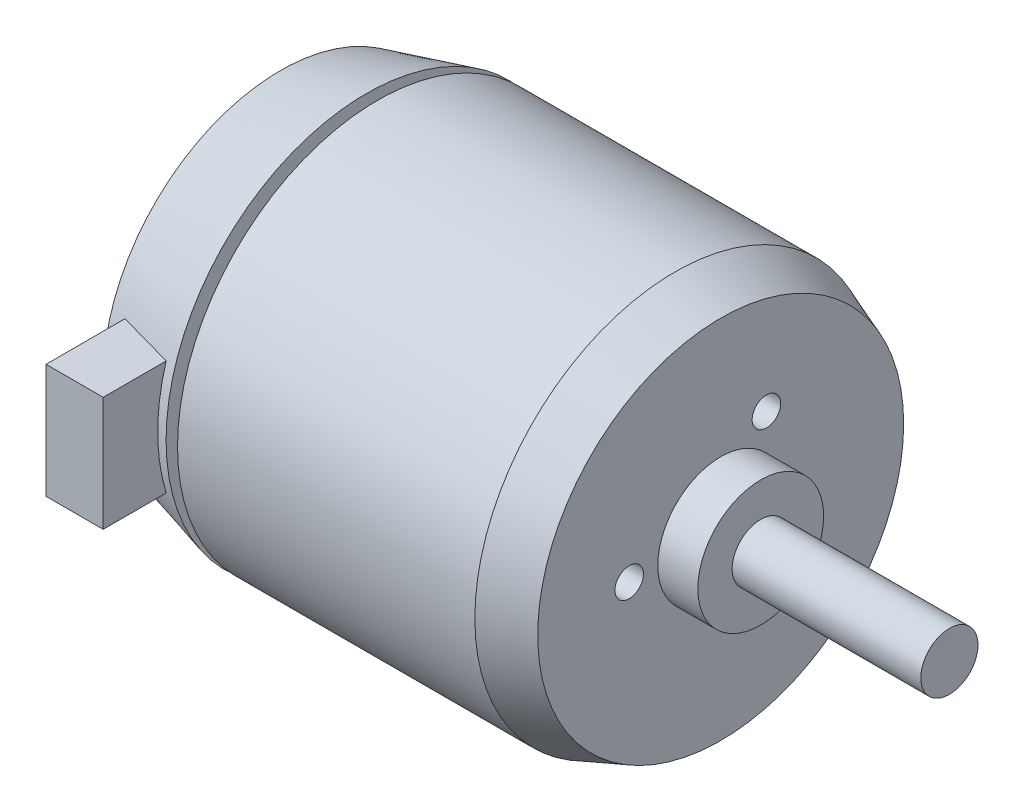
ISO-10303-21;
HEADER;
FILE_DESCRIPTION(('STEP AP214'),'2;1');
FILE_NAME('part.step','',(''),(''),'','','');
FILE_SCHEMA(('AUTOMOTIVE_DESIGN { 1 0 10303 214 1 1 1 1 }'));
ENDSEC;
DATA;
#1=APPLICATION_CONTEXT('core data for automotive mechanical design processes');
#2=APPLICATION_PROTOCOL_DEFINITION('international standard','automotive_design',2000,#1);
#3=PRODUCT_CONTEXT('',#1,'mechanical');
#4=PRODUCT('Part','Part','',(#3));
#5=PRODUCT_RELATED_PRODUCT_CATEGORY('part','',(#4));
#6=PRODUCT_DEFINITION_FORMATION('','',#4);
#7=PRODUCT_DEFINITION_CONTEXT('part definition',#1,'design');
#8=PRODUCT_DEFINITION('design','',#6,#7);
#9=PRODUCT_DEFINITION_SHAPE('','',#8);
#10=(LENGTH_UNIT() NAMED_UNIT(*) SI_UNIT(.MILLI.,.METRE.));
#11=(NAMED_UNIT(*) PLANE_ANGLE_UNIT() SI_UNIT($,.RADIAN.));
#12=(NAMED_UNIT(*) SI_UNIT($,.STERADIAN.) SOLID_ANGLE_UNIT());
#13=UNCERTAINTY_MEASURE_WITH_UNIT(LENGTH_MEASURE(1.E-05),#10,'distance_accuracy_value','');
#14=(GEOMETRIC_REPRESENTATION_CONTEXT(3) GLOBAL_UNCERTAINTY_ASSIGNED_CONTEXT((#13)) GLOBAL_UNIT_ASSIGNED_CONTEXT((#10,
#11,#12)) REPRESENTATION_CONTEXT('',''));
#15=CARTESIAN_POINT('',(0.,0.,0.));
#16=DIRECTION('',(0.,0.,1.));
#17=DIRECTION('',(1.,0.,0.));
#18=AXIS2_PLACEMENT_3D('',#15,#16,#17);
#19=CARTESIAN_POINT('',(0.,0.,0.));
#20=DIRECTION('',(1.,0.,0.));
#21=DIRECTION('',(0.,0.,-1.));
#22=AXIS2_PLACEMENT_3D('',#19,#20,#21);
#23=CYLINDRICAL_SURFACE('',#22,12.5);
#24=DIRECTION('',(-1.,0.,0.));
#25=VECTOR('',#24,1.);
#26=CARTESIAN_POINT('',(14.,-9.83394441662632,7.71644589242379));
#27=LINE('',#26,#25);
#28=CARTESIAN_POINT('',(7.5,-9.83394441662633,7.71644589242379));
#29=VERTEX_POINT('',#28);
#30=CARTESIAN_POINT('',(8.5,-9.83394441662633,7.71644589242379));
#31=VERTEX_POINT('',#30);
#32=EDGE_CURVE('E189',#29,#31,#27,.F.);
#33=ORIENTED_EDGE('',*,*,#32,.F.);
#34=CARTESIAN_POINT('',(7.5,0.,0.));
#35=DIRECTION('',(1.,0.,0.));
#36=DIRECTION('',(0.,0.,-1.));
#37=AXIS2_PLACEMENT_3D('',#34,#35,#36);
#38=CIRCLE('',#37,12.5);
#39=CARTESIAN_POINT('',(7.5,7.71644589242378,-9.83394441662633));
#40=VERTEX_POINT('',#39);
#41=EDGE_CURVE('E335',#29,#40,#38,.T.);
#42=ORIENTED_EDGE('',*,*,#41,.T.);
#43=DIRECTION('',(-1.,0.,0.));
#44=VECTOR('',#43,1.);
#45=CARTESIAN_POINT('',(14.,7.71644589242378,-9.83394441662633));
#46=LINE('',#45,#44);
#47=CARTESIAN_POINT('',(8.5,7.71644589242378,-9.83394441662633));
#48=VERTEX_POINT('',#47);
#49=EDGE_CURVE('E209',#48,#40,#46,.T.);
#50=ORIENTED_EDGE('',*,*,#49,.F.);
#51=CARTESIAN_POINT('',(8.5,0.,0.));
#52=DIRECTION('',(1.,0.,0.));
#53=DIRECTION('',(0.,0.,-1.));
#54=AXIS2_PLACEMENT_3D('',#51,#52,#53);
#55=CIRCLE('',#54,12.5);
#56=EDGE_CURVE('E198',#31,#48,#55,.T.);
#57=ORIENTED_EDGE('',*,*,#56,.F.);
#58=EDGE_LOOP('',(#33,#42,#50,#57));
#59=FACE_BOUND('',#58,.T.);
#60=ADVANCED_FACE('F43',(#59),#23,.T.);
#61=CARTESIAN_POINT('',(7.5,0.,0.));
#62=DIRECTION('',(1.,0.,0.));
#63=DIRECTION('',(0.,0.,-1.));
#64=AXIS2_PLACEMENT_3D('',#61,#62,#63);
#65=CONICAL_SURFACE('',#64,17.5,0.260602391747342);
#66=CARTESIAN_POINT('',(6.5,0.,0.));
#67=DIRECTION('',(1.,0.,0.));
#68=DIRECTION('',(0.,0.,-1.));
#69=AXIS2_PLACEMENT_3D('',#66,#67,#68);
#70=CIRCLE('',#69,17.2333333333333);
#71=CARTESIAN_POINT('',(6.5,5.,16.4920519577698));
#72=VERTEX_POINT('',#71);
#73=CARTESIAN_POINT('',(6.5,-5.,16.4920519577698));
#74=VERTEX_POINT('',#73);
#75=EDGE_CURVE('E314',#72,#74,#70,.T.);
#76=ORIENTED_EDGE('',*,*,#75,.T.);
#77=CARTESIAN_POINT('',(41.8555390593274,-5.,26.1884394384239));
#78=CARTESIAN_POINT('',(40.1503148228224,-5.,25.7254966162885));
#79=CARTESIAN_POINT('',(38.4451980615077,-5.,25.262158194358));
#80=CARTESIAN_POINT('',(35.0352232032876,-5.,24.3345318409509));
#81=CARTESIAN_POINT('',(33.3303651063327,-5.,23.8702439096561));
#82=CARTESIAN_POINT('',(28.2164793890197,-5.,22.4757824696188));
#83=CARTESIAN_POINT('',(24.8079042735639,-5.,21.5439472727277));
#84=CARTESIAN_POINT('',(19.6968979568333,-5.,20.1414623137917));
#85=CARTESIAN_POINT('',(17.9937978254108,-5.,19.673250304362));
#86=CARTESIAN_POINT('',(14.5881564767623,-5.,18.7348049816795));
#87=CARTESIAN_POINT('',(12.8856152588798,-5.,18.2645716708107));
#88=CARTESIAN_POINT('',(9.48111823261496,-5.,17.3215417794725));
#89=CARTESIAN_POINT('',(7.77916247178015,-5.,16.8487450272817));
#90=CARTESIAN_POINT('',(4.37614537987394,-5.,15.8999118986721));
#91=CARTESIAN_POINT('',(2.67508405281204,-5.,15.4238755078621));
#92=CARTESIAN_POINT('',(-0.488593028141273,-5.,14.5342686551117));
#93=CARTESIAN_POINT('',(-1.95136372966595,-5.,14.1212495117964));
#94=CARTESIAN_POINT('',(-4.87573052997007,-5.,13.2911529388012));
#95=CARTESIAN_POINT('',(-6.33732664621528,-5.,12.8740755707216));
#96=CARTESIAN_POINT('',(-9.25871564132404,-5.,12.0346027250972));
#97=CARTESIAN_POINT('',(-10.7185087907216,-5.,11.6122081898477));
#98=CARTESIAN_POINT('',(-13.6360307127028,-5.,10.760037568685));
#99=CARTESIAN_POINT('',(-15.0937593708568,-5.,10.3302610897046));
#100=CARTESIAN_POINT('',(-17.2783960203331,-5.,9.67752604311281));
#101=CARTESIAN_POINT('',(-18.0064902580686,-5.,9.45853881621163));
#102=CARTESIAN_POINT('',(-19.4616826647677,-5.,9.01729770894535));
#103=CARTESIAN_POINT('',(-20.1887808421377,-5.,8.79504385633764));
#104=CARTESIAN_POINT('',(-21.6416145625561,-5.,8.34651587683681));
#105=CARTESIAN_POINT('',(-22.367350299698,-5.,8.12024237969839));
#106=CARTESIAN_POINT('',(-23.8172210170156,-5.,7.66253709073804));
#107=CARTESIAN_POINT('',(-24.5413559456438,-5.,7.43110513539379));
#108=CARTESIAN_POINT('',(-25.9879518419133,-5.,6.96138521914165));
#109=CARTESIAN_POINT('',(-26.7104113411248,-5.,6.72309271474254));
#110=CARTESIAN_POINT('',(-27.7917776958714,-5.,6.35885984162288));
#111=CARTESIAN_POINT('',(-28.1518306659104,-5.,6.23632191131836));
#112=CARTESIAN_POINT('',(-28.8710141601665,-5.,5.98855155955006));
#113=CARTESIAN_POINT('',(-29.2301446744017,-5.,5.86331910906467));
#114=CARTESIAN_POINT('',(-29.9474673470362,-5.,5.60957058102074));
#115=CARTESIAN_POINT('',(-30.3056588835068,-5.,5.48105274196964));
#116=CARTESIAN_POINT('',(-31.0206071538809,-5.,5.22011331067389));
#117=CARTESIAN_POINT('',(-31.3773639319121,-5.,5.08769183954955));
#118=CARTESIAN_POINT('',(-32.0891602310153,-5.,4.81797996913672));
#119=CARTESIAN_POINT('',(-32.4441992191324,-5.,4.68068815668125));
#120=CARTESIAN_POINT('',(-32.9749539212796,-5.,4.47014925230673));
#121=CARTESIAN_POINT('',(-33.1515808905355,-5.,4.39919884931466));
#122=CARTESIAN_POINT('',(-33.5041225639202,-5.,4.25553858131443));
#123=CARTESIAN_POINT('',(-33.6800372500461,-5.,4.1828286721549));
#124=CARTESIAN_POINT('',(-33.8555390593274,-5.,4.10912683323533));
#125=B_SPLINE_CURVE_WITH_KNOTS('',3,(#77,#78,#79,#80,#81,#82,#83,#84,#85,#86,#87,#88,#89,#90,
#91,#92,#93,#94,#95,#96,#97,#98,#99,#100,#101,#102,#103,#104,#105,#106,#107,#108,#109,#110,#111,
#112,#113,#114,#115,#116,#117,#118,#119,#120,#121,#122,#123,#124),.UNSPECIFIED.,.F.,.F.,(4,2,2,
2,2,2,2,2,2,2,2,2,2,2,2,2,2,2,2,2,2,2,2,4),(0.,5.30084419755766,10.601687380501,
21.2026399429148,26.5015023914103,31.8003585920598,37.0995742530593,42.3988134697777,
46.9586936906715,51.5185048040677,56.0775189075748,60.6367765225526,62.9177111683432,
65.1986264436128,67.4791874672128,69.7598208873506,72.0420011016115,73.1829937221908,
74.3239986381108,75.4656287060467,76.6072233891535,77.7491520685162,78.3201772767184,
78.8912168285671),.UNSPECIFIED.);
#126=CARTESIAN_POINT('',(1.5,-5.,15.0933760305639));
#127=VERTEX_POINT('',#126);
#128=EDGE_CURVE('E302',#74,#127,#125,.T.);
#129=ORIENTED_EDGE('',*,*,#128,.T.);
#130=CARTESIAN_POINT('',(1.5,0.,0.));
#131=DIRECTION('',(-1.,0.,0.));
#132=DIRECTION('',(0.,0.,1.));
#133=AXIS2_PLACEMENT_3D('',#130,#131,#132);
#134=CIRCLE('',#133,15.9);
#135=CARTESIAN_POINT('',(1.5,5.,15.0933760305639));
#136=VERTEX_POINT('',#135);
#137=EDGE_CURVE('E283',#127,#136,#134,.T.);
#138=ORIENTED_EDGE('',*,*,#137,.T.);
#139=CARTESIAN_POINT('',(-33.8555390593274,5.,4.10912683323533));
#140=CARTESIAN_POINT('',(-33.6573396925889,5.,4.19235647014156));
#141=CARTESIAN_POINT('',(-33.4586165904845,5.,4.27432568079074));
#142=CARTESIAN_POINT('',(-33.0602811028724,5.,4.43605652493654));
#143=CARTESIAN_POINT('',(-32.8606687472001,5.,4.51581823185943));
#144=CARTESIAN_POINT('',(-32.2607678949309,5.,4.75224938574381));
#145=CARTESIAN_POINT('',(-31.8593633147046,5.,4.90608662730263));
#146=CARTESIAN_POINT('',(-31.0545371477109,5.,5.20789318673297));
#147=CARTESIAN_POINT('',(-30.6511163701667,5.,5.35586467450151));
#148=CARTESIAN_POINT('',(-29.8426025605313,5.,5.64720682773877));
#149=CARTESIAN_POINT('',(-29.4375094643112,5.,5.79057731488698));
#150=CARTESIAN_POINT('',(-28.6262617359346,5.,6.07350396843259));
#151=CARTESIAN_POINT('',(-28.2201078620511,5.,6.21306231391593));
#152=CARTESIAN_POINT('',(-27.4067562389589,5.,6.48910437789141));
#153=CARTESIAN_POINT('',(-26.9995584853279,5.,6.62558808333365));
#154=CARTESIAN_POINT('',(-26.1842638019519,5.,6.89599702109563));
#155=CARTESIAN_POINT('',(-25.7761667749286,5.,7.02992195976896));
#156=CARTESIAN_POINT('',(-24.9592616157091,5.,7.29558683337496));
#157=CARTESIAN_POINT('',(-24.5504534813498,5.,7.42732676164785));
#158=CARTESIAN_POINT('',(-23.3244463647422,5.,7.81933423896238));
#159=CARTESIAN_POINT('',(-22.5063579037406,5.,8.07682045030864));
#160=CARTESIAN_POINT('',(-20.8684422146555,5.,8.58620796955527));
#161=CARTESIAN_POINT('',(-20.0486149717339,5.,8.83810922958372));
#162=CARTESIAN_POINT('',(-18.4076166589189,5.,9.33756760068016));
#163=CARTESIAN_POINT('',(-17.5864455550099,5.,9.58512459986821));
#164=CARTESIAN_POINT('',(-15.9430678126279,5.,10.0767801953359));
#165=CARTESIAN_POINT('',(-15.1208611716218,5.,10.3208787831383));
#166=CARTESIAN_POINT('',(-13.475597889884,5.,10.8062803385954));
#167=CARTESIAN_POINT('',(-12.652541225275,5.,11.0475832252566));
#168=CARTESIAN_POINT('',(-11.0057537355476,5.,11.5278785244747));
#169=CARTESIAN_POINT('',(-10.1820229098093,5.,11.7668709349042));
#170=CARTESIAN_POINT('',(-7.71002940594404,5.,12.4809692874922));
#171=CARTESIAN_POINT('',(-6.06093752907787,5.,12.9532046311492));
#172=CARTESIAN_POINT('',(-2.75971551363832,5.,13.8926130320672));
#173=CARTESIAN_POINT('',(-1.10758397656824,5.,14.3597811647317));
#174=CARTESIAN_POINT('',(2.19784114508084,5.,15.2900099335794));
#175=CARTESIAN_POINT('',(3.85113473405648,5.,15.7530705541304));
#176=CARTESIAN_POINT('',(7.15853947854848,5.,16.6760243996043));
#177=CARTESIAN_POINT('',(8.81265060168941,5.,17.1359177406272));
#178=CARTESIAN_POINT('',(12.1215591257545,5.,18.0532294737432));
#179=CARTESIAN_POINT('',(13.7763565268557,5.,18.5106478651978));
#180=CARTESIAN_POINT('',(17.6330436972411,5.,19.5742347043596));
#181=CARTESIAN_POINT('',(19.835143018449,5.,20.1796431112269));
#182=CARTESIAN_POINT('',(24.2400913228671,5.,21.3878063480572));
#183=CARTESIAN_POINT('',(26.4429403129215,5.,21.9905611530538));
#184=CARTESIAN_POINT('',(30.8471702749862,5.,23.1934438686217));
#185=CARTESIAN_POINT('',(33.0485507251761,5.,23.7935736903881));
#186=CARTESIAN_POINT('',(37.4517432609621,5.,24.9921599653718));
#187=CARTESIAN_POINT('',(39.6535553419661,5.,25.5906164354571));
#188=CARTESIAN_POINT('',(41.8555390593274,5.,26.1884394384239));
#189=B_SPLINE_CURVE_WITH_KNOTS('',3,(#139,#140,#141,#142,#143,#144,#145,#146,#147,#148,#149,
#150,#151,#152,#153,#154,#155,#156,#157,#158,#159,#160,#161,#162,#163,#164,#165,#166,#167,#168,
#169,#170,#171,#172,#173,#174,#175,#176,#177,#178,#179,#180,#181,#182,#183,#184,#185,#186,#187,
#188),.UNSPECIFIED.,.F.,.F.,(4,2,2,2,2,2,2,2,2,2,2,2,2,2,2,2,2,2,2,2,2,2,2,2,4),(0.,
0.644884317412826,1.28974715876079,2.57930293736005,3.86837713677237,5.15750123651473,
6.44587233932407,7.73424890942769,9.02277245731397,10.3112999318256,12.8842270610734,
15.4571762358845,18.0301915761928,20.6032132223392,23.1763092253273,25.749407597287,
30.8955162510188,36.0462442389515,41.1969918207898,46.347549580729,51.4981086692925,
58.3495183723683,65.2009923995094,72.0461421724767,78.8912226932887),.UNSPECIFIED.);
#190=EDGE_CURVE('E328',#136,#72,#189,.T.);
#191=ORIENTED_EDGE('',*,*,#190,.T.);
#192=EDGE_LOOP('',(#76,#129,#138,#191));
#193=FACE_BOUND('',#192,.T.);
#194=CARTESIAN_POINT('',(0.,0.,0.));
#195=DIRECTION('',(1.,0.,0.));
#196=DIRECTION('',(0.,0.,-1.));
#197=AXIS2_PLACEMENT_3D('',#194,#195,#196);
#198=CIRCLE('',#197,15.5);
#199=CARTESIAN_POINT('',(0.,0.,-15.5));
#200=VERTEX_POINT('',#199);
#201=EDGE_CURVE('E201',#200,#200,#198,.T.);
#202=ORIENTED_EDGE('',*,*,#201,.T.);
#203=EDGE_LOOP('',(#202));
#204=FACE_BOUND('',#203,.T.);
#205=CARTESIAN_POINT('',(7.5,0.,0.));
#206=DIRECTION('',(1.,0.,0.));
#207=DIRECTION('',(0.,0.,-1.));
#208=AXIS2_PLACEMENT_3D('',#205,#206,#207);
#209=CIRCLE('',#208,17.5);
#210=CARTESIAN_POINT('',(7.5,0.,-17.5));
#211=VERTEX_POINT('',#210);
#212=EDGE_CURVE('E288',#211,#211,#209,.T.);
#213=ORIENTED_EDGE('',*,*,#212,.F.);
#214=EDGE_LOOP('',(#213));
#215=FACE_BOUND('',#214,.T.);
#216=ADVANCED_FACE('F155',(#193,#204,#215),#65,.T.);
#217=CARTESIAN_POINT('',(0.,15.5,0.));
#218=DIRECTION('',(-1.,0.,0.));
#219=DIRECTION('',(0.,0.,1.));
#220=AXIS2_PLACEMENT_3D('',#217,#218,#219);
#221=PLANE('',#220);
#222=CARTESIAN_POINT('',(0.,-6.71751442127221,-6.7175144212722));
#223=DIRECTION('',(-1.,0.,0.));
#224=DIRECTION('',(0.,0.,1.));
#225=AXIS2_PLACEMENT_3D('',#222,#223,#224);
#226=CIRCLE('',#225,1.49999999999999);
#227=CARTESIAN_POINT('',(0.,-6.71751442127221,-5.21751442127221));
#228=VERTEX_POINT('',#227);
#229=EDGE_CURVE('E747',#228,#228,#226,.T.);
#230=ORIENTED_EDGE('',*,*,#229,.F.);
#231=EDGE_LOOP('',(#230));
#232=FACE_BOUND('',#231,.T.);
#233=CARTESIAN_POINT('',(0.,-8.83883476483184,8.83883476483185));
#234=DIRECTION('',(-1.,0.,0.));
#235=DIRECTION('',(0.,0.,1.));
#236=AXIS2_PLACEMENT_3D('',#233,#234,#235);
#237=CIRCLE('',#236,1.49999999999999);
#238=CARTESIAN_POINT('',(0.,-8.83883476483184,10.3388347648318));
#239=VERTEX_POINT('',#238);
#240=EDGE_CURVE('E743',#239,#239,#237,.T.);
#241=ORIENTED_EDGE('',*,*,#240,.F.);
#242=EDGE_LOOP('',(#241));
#243=FACE_BOUND('',#242,.T.);
#244=CARTESIAN_POINT('',(0.,6.7175144212722,6.7175144212722));
#245=DIRECTION('',(-1.,0.,0.));
#246=DIRECTION('',(0.,0.,1.));
#247=AXIS2_PLACEMENT_3D('',#244,#245,#246);
#248=CIRCLE('',#247,1.49999999999999);
#249=CARTESIAN_POINT('',(0.,6.7175144212722,8.21751442127219));
#250=VERTEX_POINT('',#249);
#251=EDGE_CURVE('E753',#250,#250,#248,.T.);
#252=ORIENTED_EDGE('',*,*,#251,.F.);
#253=EDGE_LOOP('',(#252));
#254=FACE_BOUND('',#253,.T.);
#255=CARTESIAN_POINT('',(0.,8.83883476483184,-8.83883476483185));
#256=DIRECTION('',(-1.,0.,0.));
#257=DIRECTION('',(0.,0.,1.));
#258=AXIS2_PLACEMENT_3D('',#255,#256,#257);
#259=CIRCLE('',#258,1.49999999999999);
#260=CARTESIAN_POINT('',(0.,8.83883476483184,-7.33883476483186));
#261=VERTEX_POINT('',#260);
#262=EDGE_CURVE('E349',#261,#261,#259,.T.);
#263=ORIENTED_EDGE('',*,*,#262,.F.);
#264=EDGE_LOOP('',(#263));
#265=FACE_BOUND('',#264,.T.);
#266=CARTESIAN_POINT('',(0.,0.,0.));
#267=DIRECTION('',(-1.,0.,0.));
#268=DIRECTION('',(0.,0.,1.));
#269=AXIS2_PLACEMENT_3D('',#266,#267,#268);
#270=CIRCLE('',#269,4.);
#271=CARTESIAN_POINT('',(0.,0.,4.));
#272=VERTEX_POINT('',#271);
#273=EDGE_CURVE('E208',#272,#272,#270,.T.);
#274=ORIENTED_EDGE('',*,*,#273,.F.);
#275=EDGE_LOOP('',(#274));
#276=FACE_BOUND('',#275,.T.);
#277=ORIENTED_EDGE('',*,*,#201,.F.);
#278=EDGE_LOOP('',(#277));
#279=FACE_BOUND('',#278,.T.);
#280=ADVANCED_FACE('F162',(#232,#243,#254,#265,#276,#279),#221,.T.);
#281=CARTESIAN_POINT('',(38.5,0.,0.));
#282=DIRECTION('',(1.,0.,0.));
#283=DIRECTION('',(0.,0.,-1.));
#284=AXIS2_PLACEMENT_3D('',#281,#282,#283);
#285=PLANE('',#284);
#286=CARTESIAN_POINT('',(38.5,0.,0.));
#287=DIRECTION('',(1.,0.,0.));
#288=DIRECTION('',(0.,0.,-1.));
#289=AXIS2_PLACEMENT_3D('',#286,#287,#288);
#290=CIRCLE('',#289,16.);
#291=CARTESIAN_POINT('',(38.5,0.,-16.));
#292=VERTEX_POINT('',#291);
#293=EDGE_CURVE('E52',#292,#292,#290,.T.);
#294=ORIENTED_EDGE('',*,*,#293,.T.);
#295=EDGE_LOOP('',(#294));
#296=FACE_BOUND('',#295,.T.);
#297=CARTESIAN_POINT('',(38.5,-6.92820323027551,-4.));
#298=DIRECTION('',(1.,0.,0.));
#299=DIRECTION('',(0.,0.,-1.));
#300=AXIS2_PLACEMENT_3D('',#297,#298,#299);
#301=CIRCLE('',#300,1.24999999999999);
#302=CARTESIAN_POINT('',(38.5,-6.92820323027551,-5.24999999999999));
#303=VERTEX_POINT('',#302);
#304=EDGE_CURVE('E260',#303,#303,#301,.T.);
#305=ORIENTED_EDGE('',*,*,#304,.F.);
#306=EDGE_LOOP('',(#305));
#307=FACE_BOUND('',#306,.T.);
#308=CARTESIAN_POINT('',(38.5,6.92820323027551,-4.));
#309=DIRECTION('',(1.,0.,0.));
#310=DIRECTION('',(0.,0.,-1.));
#311=AXIS2_PLACEMENT_3D('',#308,#309,#310);
#312=CIRCLE('',#311,1.24999999999999);
#313=CARTESIAN_POINT('',(38.5,6.92820323027551,-5.24999999999999));
#314=VERTEX_POINT('',#313);
#315=EDGE_CURVE('E264',#314,#314,#312,.T.);
#316=ORIENTED_EDGE('',*,*,#315,.F.);
#317=EDGE_LOOP('',(#316));
#318=FACE_BOUND('',#317,.T.);
#319=CARTESIAN_POINT('',(38.5,0.,8.));
#320=DIRECTION('',(1.,0.,0.));
#321=DIRECTION('',(0.,0.,-1.));
#322=AXIS2_PLACEMENT_3D('',#319,#320,#321);
#323=CIRCLE('',#322,1.24999999999999);
#324=CARTESIAN_POINT('',(38.5,0.,6.75000000000001));
#325=VERTEX_POINT('',#324);
#326=EDGE_CURVE('E268',#325,#325,#323,.T.);
#327=ORIENTED_EDGE('',*,*,#326,.F.);
#328=EDGE_LOOP('',(#327));
#329=FACE_BOUND('',#328,.T.);
#330=CARTESIAN_POINT('',(38.5,0.,0.));
#331=DIRECTION('',(1.,0.,0.));
#332=DIRECTION('',(0.,0.,-1.));
#333=AXIS2_PLACEMENT_3D('',#330,#331,#332);
#334=CIRCLE('',#333,5.5);
#335=CARTESIAN_POINT('',(38.5,0.,5.5));
#336=VERTEX_POINT('',#335);
#337=EDGE_CURVE('E271',#336,#336,#334,.T.);
#338=ORIENTED_EDGE('',*,*,#337,.F.);
#339=EDGE_LOOP('',(#338));
#340=FACE_BOUND('',#339,.T.);
#341=ADVANCED_FACE('F252',(#296,#307,#318,#329,#340),#285,.T.);
#342=CARTESIAN_POINT('',(0.,0.,0.));
#343=DIRECTION('',(1.,0.,0.));
#344=DIRECTION('',(0.,0.,-1.));
#345=AXIS2_PLACEMENT_3D('',#342,#343,#344);
#346=CYLINDRICAL_SURFACE('',#345,17.5);
#347=CARTESIAN_POINT('',(34.5000000000001,0.,0.));
#348=DIRECTION('',(1.,0.,0.));
#349=DIRECTION('',(0.,0.,-1.));
#350=AXIS2_PLACEMENT_3D('',#347,#348,#349);
#351=CIRCLE('',#350,17.5);
#352=CARTESIAN_POINT('',(34.5000000000001,0.,-17.5));
#353=VERTEX_POINT('',#352);
#354=EDGE_CURVE('E11',#353,#353,#351,.F.);
#355=ORIENTED_EDGE('',*,*,#354,.T.);
#356=EDGE_LOOP('',(#355));
#357=FACE_BOUND('',#356,.T.);
#358=CARTESIAN_POINT('',(8.5,0.,0.));
#359=DIRECTION('',(1.,0.,0.));
#360=DIRECTION('',(0.,0.,-1.));
#361=AXIS2_PLACEMENT_3D('',#358,#359,#360);
#362=CIRCLE('',#361,17.5);
#363=CARTESIAN_POINT('',(8.5,0.,-17.5));
#364=VERTEX_POINT('',#363);
#365=EDGE_CURVE('E197',#364,#364,#362,.T.);
#366=ORIENTED_EDGE('',*,*,#365,.T.);
#367=EDGE_LOOP('',(#366));
#368=FACE_BOUND('',#367,.T.);
#369=ADVANCED_FACE('F178',(#357,#368),#346,.T.);
#370=CARTESIAN_POINT('',(8.5,17.5,0.));
#371=DIRECTION('',(-1.,0.,0.));
#372=DIRECTION('',(0.,0.,1.));
#373=AXIS2_PLACEMENT_3D('',#370,#371,#372);
#374=PLANE('',#373);
#375=CARTESIAN_POINT('',(8.5,-8.83883476483184,8.83883476483185));
#376=DIRECTION('',(-1.,0.,0.));
#377=DIRECTION('',(0.,0.,1.));
#378=AXIS2_PLACEMENT_3D('',#375,#376,#377);
#379=CIRCLE('',#378,1.49999999999999);
#380=CARTESIAN_POINT('',(8.5,-7.71644589242378,9.83394441662633));
#381=VERTEX_POINT('',#380);
#382=EDGE_CURVE('E66',#31,#381,#379,.T.);
#383=ORIENTED_EDGE('',*,*,#382,.F.);
#384=ORIENTED_EDGE('',*,*,#56,.T.);
#385=CARTESIAN_POINT('',(8.5,8.83883476483184,-8.83883476483185));
#386=DIRECTION('',(-1.,0.,0.));
#387=DIRECTION('',(0.,0.,1.));
#388=AXIS2_PLACEMENT_3D('',#385,#386,#387);
#389=CIRCLE('',#388,1.49999999999999);
#390=CARTESIAN_POINT('',(8.5,9.83394441662633,-7.71644589242379));
#391=VERTEX_POINT('',#390);
#392=EDGE_CURVE('E196',#391,#48,#389,.T.);
#393=ORIENTED_EDGE('',*,*,#392,.F.);
#394=EDGE_CURVE('E185',#391,#381,#55,.T.);
#395=ORIENTED_EDGE('',*,*,#394,.T.);
#396=EDGE_LOOP('',(#383,#384,#393,#395));
#397=FACE_BOUND('',#396,.T.);
#398=ORIENTED_EDGE('',*,*,#365,.F.);
#399=EDGE_LOOP('',(#398));
#400=FACE_BOUND('',#399,.T.);
#401=ADVANCED_FACE('F169',(#397,#400),#374,.T.);
#402=DIRECTION('',(-1.,0.,0.));
#403=VECTOR('',#402,1.);
#404=CARTESIAN_POINT('',(14.,-7.71644589242378,9.83394441662633));
#405=LINE('',#404,#403);
#406=CARTESIAN_POINT('',(7.5,-7.71644589242378,9.83394441662633));
#407=VERTEX_POINT('',#406);
#408=EDGE_CURVE('E182',#381,#407,#405,.T.);
#409=ORIENTED_EDGE('',*,*,#408,.F.);
#410=ORIENTED_EDGE('',*,*,#394,.F.);
#411=DIRECTION('',(-1.,0.,0.));
#412=VECTOR('',#411,1.);
#413=CARTESIAN_POINT('',(14.,9.83394441662632,-7.71644589242379));
#414=LINE('',#413,#412);
#415=CARTESIAN_POINT('',(7.5,9.83394441662633,-7.71644589242379));
#416=VERTEX_POINT('',#415);
#417=EDGE_CURVE('E190',#416,#391,#414,.F.);
#418=ORIENTED_EDGE('',*,*,#417,.F.);
#419=EDGE_CURVE('E187',#416,#407,#38,.T.);
#420=ORIENTED_EDGE('',*,*,#419,.T.);
#421=EDGE_LOOP('',(#409,#410,#418,#420));
#422=FACE_BOUND('',#421,.T.);
#423=ADVANCED_FACE('F158',(#422),#23,.T.);
#424=CARTESIAN_POINT('',(7.5,12.5,0.));
#425=DIRECTION('',(1.,0.,0.));
#426=DIRECTION('',(0.,0.,-1.));
#427=AXIS2_PLACEMENT_3D('',#424,#425,#426);
#428=PLANE('',#427);
#429=CARTESIAN_POINT('',(7.5,-8.83883476483184,8.83883476483185));
#430=DIRECTION('',(1.,0.,0.));
#431=DIRECTION('',(0.,0.,-1.));
#432=AXIS2_PLACEMENT_3D('',#429,#430,#431);
#433=CIRCLE('',#432,1.49999999999999);
#434=EDGE_CURVE('E745',#407,#29,#433,.T.);
#435=ORIENTED_EDGE('',*,*,#434,.F.);
#436=ORIENTED_EDGE('',*,*,#419,.F.);
#437=CARTESIAN_POINT('',(7.5,8.83883476483184,-8.83883476483185));
#438=DIRECTION('',(1.,0.,0.));
#439=DIRECTION('',(0.,0.,-1.));
#440=AXIS2_PLACEMENT_3D('',#437,#438,#439);
#441=CIRCLE('',#440,1.49999999999999);
#442=EDGE_CURVE('E344',#40,#416,#441,.T.);
#443=ORIENTED_EDGE('',*,*,#442,.F.);
#444=ORIENTED_EDGE('',*,*,#41,.F.);
#445=EDGE_LOOP('',(#435,#436,#443,#444));
#446=FACE_BOUND('',#445,.T.);
#447=ORIENTED_EDGE('',*,*,#212,.T.);
#448=EDGE_LOOP('',(#447));
#449=FACE_BOUND('',#448,.T.);
#450=ADVANCED_FACE('F168',(#446,#449),#428,.T.);
#451=CARTESIAN_POINT('',(6.5,-5.,-17.502));
#452=DIRECTION('',(1.,0.,0.));
#453=DIRECTION('',(0.,0.,-1.));
#454=AXIS2_PLACEMENT_3D('',#451,#452,#453);
#455=PLANE('',#454);
#456=ORIENTED_EDGE('',*,*,#75,.F.);
#457=DIRECTION('',(0.,0.,1.));
#458=VECTOR('',#457,1.);
#459=CARTESIAN_POINT('',(6.5,5.,-17.502));
#460=LINE('',#459,#458);
#461=CARTESIAN_POINT('',(6.5,5.,22.));
#462=VERTEX_POINT('',#461);
#463=EDGE_CURVE('E301',#72,#462,#460,.T.);
#464=ORIENTED_EDGE('',*,*,#463,.T.);
#465=DIRECTION('',(0.,1.,0.));
#466=VECTOR('',#465,1.);
#467=CARTESIAN_POINT('',(6.5,-5.,22.));
#468=LINE('',#467,#466);
#469=CARTESIAN_POINT('',(6.5,-5.,22.));
#470=VERTEX_POINT('',#469);
#471=EDGE_CURVE('E289',#470,#462,#468,.T.);
#472=ORIENTED_EDGE('',*,*,#471,.F.);
#473=DIRECTION('',(0.,0.,1.));
#474=VECTOR('',#473,1.);
#475=CARTESIAN_POINT('',(6.5,-5.,-17.502));
#476=LINE('',#475,#474);
#477=EDGE_CURVE('E299',#74,#470,#476,.T.);
#478=ORIENTED_EDGE('',*,*,#477,.F.);
#479=EDGE_LOOP('',(#456,#464,#472,#478));
#480=FACE_BOUND('',#479,.T.);
#481=ADVANCED_FACE('F175',(#480),#455,.T.);
#482=CARTESIAN_POINT('',(6.5,5.,-17.502));
#483=DIRECTION('',(0.,1.,0.));
#484=DIRECTION('',(0.,0.,1.));
#485=AXIS2_PLACEMENT_3D('',#482,#483,#484);
#486=PLANE('',#485);
#487=ORIENTED_EDGE('',*,*,#190,.F.);
#488=DIRECTION('',(0.,0.,1.));
#489=VECTOR('',#488,1.);
#490=CARTESIAN_POINT('',(1.5,5.,-17.502));
#491=LINE('',#490,#489);
#492=CARTESIAN_POINT('',(1.5,5.,22.));
#493=VERTEX_POINT('',#492);
#494=EDGE_CURVE('E304',#136,#493,#491,.T.);
#495=ORIENTED_EDGE('',*,*,#494,.T.);
#496=DIRECTION('',(-1.,0.,0.));
#497=VECTOR('',#496,1.);
#498=CARTESIAN_POINT('',(6.5,5.,22.));
#499=LINE('',#498,#497);
#500=EDGE_CURVE('E293',#462,#493,#499,.T.);
#501=ORIENTED_EDGE('',*,*,#500,.F.);
#502=ORIENTED_EDGE('',*,*,#463,.F.);
#503=EDGE_LOOP('',(#487,#495,#501,#502));
#504=FACE_BOUND('',#503,.T.);
#505=ADVANCED_FACE('F324',(#504),#486,.T.);
#506=CARTESIAN_POINT('',(0.,0.,22.));
#507=DIRECTION('',(0.,0.,1.));
#508=DIRECTION('',(1.,0.,0.));
#509=AXIS2_PLACEMENT_3D('',#506,#507,#508);
#510=PLANE('',#509);
#511=DIRECTION('',(1.,0.,0.));
#512=VECTOR('',#511,1.);
#513=CARTESIAN_POINT('',(1.5,-5.,22.));
#514=LINE('',#513,#512);
#515=CARTESIAN_POINT('',(1.5,-5.,22.));
#516=VERTEX_POINT('',#515);
#517=EDGE_CURVE('E285',#516,#470,#514,.T.);
#518=ORIENTED_EDGE('',*,*,#517,.T.);
#519=ORIENTED_EDGE('',*,*,#471,.T.);
#520=ORIENTED_EDGE('',*,*,#500,.T.);
#521=DIRECTION('',(0.,-1.,0.));
#522=VECTOR('',#521,1.);
#523=CARTESIAN_POINT('',(1.5,5.,22.));
#524=LINE('',#523,#522);
#525=EDGE_CURVE('E290',#493,#516,#524,.T.);
#526=ORIENTED_EDGE('',*,*,#525,.T.);
#527=EDGE_LOOP('',(#518,#519,#520,#526));
#528=FACE_BOUND('',#527,.T.);
#529=ADVANCED_FACE('F322',(#528),#510,.T.);
#530=CARTESIAN_POINT('',(1.5,-5.,-17.502));
#531=DIRECTION('',(0.,-1.,0.));
#532=DIRECTION('',(0.,0.,-1.));
#533=AXIS2_PLACEMENT_3D('',#530,#531,#532);
#534=PLANE('',#533);
#535=ORIENTED_EDGE('',*,*,#128,.F.);
#536=ORIENTED_EDGE('',*,*,#477,.T.);
#537=ORIENTED_EDGE('',*,*,#517,.F.);
#538=DIRECTION('',(0.,0.,1.));
#539=VECTOR('',#538,1.);
#540=CARTESIAN_POINT('',(1.5,-5.,-17.502));
#541=LINE('',#540,#539);
#542=EDGE_CURVE('E294',#127,#516,#541,.T.);
#543=ORIENTED_EDGE('',*,*,#542,.F.);
#544=EDGE_LOOP('',(#535,#536,#537,#543));
#545=FACE_BOUND('',#544,.T.);
#546=ADVANCED_FACE('F316',(#545),#534,.T.);
#547=CARTESIAN_POINT('',(1.5,5.,-17.502));
#548=DIRECTION('',(-1.,0.,0.));
#549=DIRECTION('',(0.,0.,1.));
#550=AXIS2_PLACEMENT_3D('',#547,#548,#549);
#551=PLANE('',#550);
#552=ORIENTED_EDGE('',*,*,#137,.F.);
#553=ORIENTED_EDGE('',*,*,#542,.T.);
#554=ORIENTED_EDGE('',*,*,#525,.F.);
#555=ORIENTED_EDGE('',*,*,#494,.F.);
#556=EDGE_LOOP('',(#552,#553,#554,#555));
#557=FACE_BOUND('',#556,.T.);
#558=ADVANCED_FACE('F177',(#557),#551,.T.);
#559=CARTESIAN_POINT('',(-1.,0.,0.));
#560=DIRECTION('',(1.,0.,0.));
#561=DIRECTION('',(0.,0.,-1.));
#562=AXIS2_PLACEMENT_3D('',#559,#560,#561);
#563=CYLINDRICAL_SURFACE('',#562,4.);
#564=CARTESIAN_POINT('',(-1.,0.,0.));
#565=DIRECTION('',(-1.,0.,0.));
#566=DIRECTION('',(0.,0.,1.));
#567=AXIS2_PLACEMENT_3D('',#564,#565,#566);
#568=CIRCLE('',#567,4.);
#569=CARTESIAN_POINT('',(-1.,0.,4.));
#570=VERTEX_POINT('',#569);
#571=EDGE_CURVE('E281',#570,#570,#568,.T.);
#572=ORIENTED_EDGE('',*,*,#571,.F.);
#573=EDGE_LOOP('',(#572));
#574=FACE_BOUND('',#573,.T.);
#575=ORIENTED_EDGE('',*,*,#273,.T.);
#576=EDGE_LOOP('',(#575));
#577=FACE_BOUND('',#576,.T.);
#578=ADVANCED_FACE('F385',(#574,#577),#563,.T.);
#579=CARTESIAN_POINT('',(-1.,0.,0.));
#580=DIRECTION('',(-1.,0.,0.));
#581=DIRECTION('',(0.,0.,1.));
#582=AXIS2_PLACEMENT_3D('',#579,#580,#581);
#583=PLANE('',#582);
#584=ORIENTED_EDGE('',*,*,#571,.T.);
#585=EDGE_LOOP('',(#584));
#586=FACE_BOUND('',#585,.T.);
#587=ADVANCED_FACE('F376',(#586),#583,.T.);
#588=CARTESIAN_POINT('',(42.,0.,0.));
#589=DIRECTION('',(-1.,0.,0.));
#590=DIRECTION('',(0.,0.,1.));
#591=AXIS2_PLACEMENT_3D('',#588,#589,#590);
#592=CYLINDRICAL_SURFACE('',#591,5.5);
#593=CARTESIAN_POINT('',(42.,0.,0.));
#594=DIRECTION('',(1.,0.,0.));
#595=DIRECTION('',(0.,0.,-1.));
#596=AXIS2_PLACEMENT_3D('',#593,#594,#595);
#597=CIRCLE('',#596,5.5);
#598=CARTESIAN_POINT('',(42.,0.,5.5));
#599=VERTEX_POINT('',#598);
#600=EDGE_CURVE('E280',#599,#599,#597,.T.);
#601=CARTESIAN_POINT('',(42.,0.,5.5));
#602=CARTESIAN_POINT('',(41.9635416666667,0.,5.5));
#603=CARTESIAN_POINT('',(41.9270833333333,0.,5.5));
#604=CARTESIAN_POINT('',(41.8541666666667,0.,5.5));
#605=CARTESIAN_POINT('',(41.8177083333333,0.,5.5));
#606=CARTESIAN_POINT('',(41.7447916666667,0.,5.5));
#607=CARTESIAN_POINT('',(41.7083333333333,0.,5.5));
#608=CARTESIAN_POINT('',(41.6354166666667,0.,5.5));
#609=CARTESIAN_POINT('',(41.5989583333333,0.,5.5));
#610=CARTESIAN_POINT('',(41.5260416666667,0.,5.5));
#611=CARTESIAN_POINT('',(41.4895833333333,0.,5.5));
#612=CARTESIAN_POINT('',(41.4166666666667,0.,5.5));
#613=CARTESIAN_POINT('',(41.3802083333333,0.,5.5));
#614=CARTESIAN_POINT('',(41.3072916666667,0.,5.5));
#615=CARTESIAN_POINT('',(41.2708333333333,0.,5.5));
#616=CARTESIAN_POINT('',(41.1979166666667,0.,5.5));
#617=CARTESIAN_POINT('',(41.1614583333333,0.,5.5));
#618=CARTESIAN_POINT('',(41.0885416666667,0.,5.5));
#619=CARTESIAN_POINT('',(41.0520833333333,0.,5.5));
#620=CARTESIAN_POINT('',(40.9791666666667,0.,5.5));
#621=CARTESIAN_POINT('',(40.9427083333333,0.,5.5));
#622=CARTESIAN_POINT('',(40.8697916666667,0.,5.5));
#623=CARTESIAN_POINT('',(40.8333333333333,0.,5.5));
#624=CARTESIAN_POINT('',(40.7604166666667,0.,5.5));
#625=CARTESIAN_POINT('',(40.7239583333333,0.,5.5));
#626=CARTESIAN_POINT('',(40.6510416666667,0.,5.5));
#627=CARTESIAN_POINT('',(40.6145833333333,0.,5.5));
#628=CARTESIAN_POINT('',(40.5416666666667,0.,5.5));
#629=CARTESIAN_POINT('',(40.5052083333333,0.,5.5));
#630=CARTESIAN_POINT('',(40.4322916666667,0.,5.5));
#631=CARTESIAN_POINT('',(40.3958333333333,0.,5.5));
#632=CARTESIAN_POINT('',(40.3229166666667,0.,5.5));
#633=CARTESIAN_POINT('',(40.2864583333333,0.,5.5));
#634=CARTESIAN_POINT('',(40.2135416666667,0.,5.5));
#635=CARTESIAN_POINT('',(40.1770833333333,0.,5.5));
#636=CARTESIAN_POINT('',(40.1041666666667,0.,5.5));
#637=CARTESIAN_POINT('',(40.0677083333333,0.,5.5));
#638=CARTESIAN_POINT('',(39.9947916666667,0.,5.5));
#639=CARTESIAN_POINT('',(39.9583333333333,0.,5.5));
#640=CARTESIAN_POINT('',(39.8854166666667,0.,5.5));
#641=CARTESIAN_POINT('',(39.8489583333333,0.,5.5));
#642=CARTESIAN_POINT('',(39.7760416666667,0.,5.5));
#643=CARTESIAN_POINT('',(39.7395833333333,0.,5.5));
#644=CARTESIAN_POINT('',(39.6666666666667,0.,5.5));
#645=CARTESIAN_POINT('',(39.6302083333333,0.,5.5));
#646=CARTESIAN_POINT('',(39.5572916666667,0.,5.5));
#647=CARTESIAN_POINT('',(39.5208333333333,0.,5.5));
#648=CARTESIAN_POINT('',(39.4479166666667,0.,5.5));
#649=CARTESIAN_POINT('',(39.4114583333333,0.,5.5));
#650=CARTESIAN_POINT('',(39.3385416666667,0.,5.5));
#651=CARTESIAN_POINT('',(39.3020833333333,0.,5.5));
#652=CARTESIAN_POINT('',(39.2291666666667,0.,5.5));
#653=CARTESIAN_POINT('',(39.1927083333333,0.,5.5));
#654=CARTESIAN_POINT('',(39.1197916666667,0.,5.5));
#655=CARTESIAN_POINT('',(39.0833333333333,0.,5.5));
#656=CARTESIAN_POINT('',(39.0104166666667,0.,5.5));
#657=CARTESIAN_POINT('',(38.9739583333333,0.,5.5));
#658=CARTESIAN_POINT('',(38.9010416666667,0.,5.5));
#659=CARTESIAN_POINT('',(38.8645833333333,0.,5.5));
#660=CARTESIAN_POINT('',(38.7916666666667,0.,5.5));
#661=CARTESIAN_POINT('',(38.7552083333333,0.,5.5));
#662=CARTESIAN_POINT('',(38.6822916666667,0.,5.5));
#663=CARTESIAN_POINT('',(38.6458333333333,0.,5.5));
#664=CARTESIAN_POINT('',(38.5729166666667,0.,5.5));
#665=CARTESIAN_POINT('',(38.5364583333333,0.,5.5));
#666=CARTESIAN_POINT('',(38.5,0.,5.5));
#667=B_SPLINE_CURVE_WITH_KNOTS('',3,(#601,#602,#603,#604,#605,#606,#607,#608,#609,#610,#611,
#612,#613,#614,#615,#616,#617,#618,#619,#620,#621,#622,#623,#624,#625,#626,#627,#628,#629,#630,
#631,#632,#633,#634,#635,#636,#637,#638,#639,#640,#641,#642,#643,#644,#645,#646,#647,#648,#649,
#650,#651,#652,#653,#654,#655,#656,#657,#658,#659,#660,#661,#662,#663,#664,#665,#666),
.UNSPECIFIED.,.F.,.F.,(4,2,2,2,2,2,2,2,2,2,2,2,2,2,2,2,2,2,2,2,2,2,2,2,2,2,2,2,2,2,2,2,4),(0.,
0.109375000000002,0.218750000000004,0.328125000000005,0.4375,0.546875000000002,
0.656250000000004,0.765625000000006,0.875000000000001,0.984375000000003,1.09375,
1.20312500000001,1.3125,1.421875,1.53125,1.64062500000001,1.75,1.859375,1.96875000000001,
2.07812500000001,2.1875,2.296875,2.40625000000001,2.51562500000001,2.625,2.734375,
2.84375000000001,2.95312500000001,3.0625,3.171875,3.28125000000001,3.39062500000001,3.5),.UNSPECIFIED.);
#668=EDGE_CURVE('BSEAM374',#599,#336,#667,.T.);
#669=ORIENTED_EDGE('',*,*,#600,.F.);
#670=ORIENTED_EDGE('',*,*,#337,.T.);
#671=ORIENTED_EDGE('',*,*,#668,.T.);
#672=ORIENTED_EDGE('',*,*,#668,.F.);
#673=EDGE_LOOP('',(#669,#671,#670,#672));
#674=FACE_BOUND('',#673,.T.);
#675=ADVANCED_FACE('F374',(#674),#592,.T.);
#676=CARTESIAN_POINT('',(42.,0.,0.));
#677=DIRECTION('',(1.,0.,0.));
#678=DIRECTION('',(0.,0.,-1.));
#679=AXIS2_PLACEMENT_3D('',#676,#677,#678);
#680=PLANE('',#679);
#681=CARTESIAN_POINT('',(42.,0.,0.));
#682=DIRECTION('',(1.,0.,0.));
#683=DIRECTION('',(0.,0.,-1.));
#684=AXIS2_PLACEMENT_3D('',#681,#682,#683);
#685=CIRCLE('',#684,2.5);
#686=CARTESIAN_POINT('',(42.,0.,-2.5));
#687=VERTEX_POINT('',#686);
#688=EDGE_CURVE('E212',#687,#687,#685,.T.);
#689=ORIENTED_EDGE('',*,*,#688,.F.);
#690=EDGE_LOOP('',(#689));
#691=FACE_BOUND('',#690,.T.);
#692=ORIENTED_EDGE('',*,*,#600,.T.);
#693=EDGE_LOOP('',(#692));
#694=FACE_BOUND('',#693,.T.);
#695=ADVANCED_FACE('F372',(#691,#694),#680,.T.);
#696=CARTESIAN_POINT('',(58.5,0.,0.));
#697=DIRECTION('',(-1.,0.,0.));
#698=DIRECTION('',(0.,0.,1.));
#699=AXIS2_PLACEMENT_3D('',#696,#697,#698);
#700=CYLINDRICAL_SURFACE('',#699,2.5);
#701=CARTESIAN_POINT('',(58.5,0.,0.));
#702=DIRECTION('',(1.,0.,0.));
#703=DIRECTION('',(0.,0.,-1.));
#704=AXIS2_PLACEMENT_3D('',#701,#702,#703);
#705=CIRCLE('',#704,2.5);
#706=CARTESIAN_POINT('',(58.5,0.,-2.5));
#707=VERTEX_POINT('',#706);
#708=EDGE_CURVE('E365',#707,#707,#705,.T.);
#709=ORIENTED_EDGE('',*,*,#708,.F.);
#710=EDGE_LOOP('',(#709));
#711=FACE_BOUND('',#710,.T.);
#712=ORIENTED_EDGE('',*,*,#688,.T.);
#713=EDGE_LOOP('',(#712));
#714=FACE_BOUND('',#713,.T.);
#715=ADVANCED_FACE('F382',(#711,#714),#700,.T.);
#716=CARTESIAN_POINT('',(58.5,0.,0.));
#717=DIRECTION('',(1.,0.,0.));
#718=DIRECTION('',(0.,0.,-1.));
#719=AXIS2_PLACEMENT_3D('',#716,#717,#718);
#720=PLANE('',#719);
#721=ORIENTED_EDGE('',*,*,#708,.T.);
#722=EDGE_LOOP('',(#721));
#723=FACE_BOUND('',#722,.T.);
#724=ADVANCED_FACE('F625',(#723),#720,.T.);
#725=CARTESIAN_POINT('',(10.5,0.,8.));
#726=DIRECTION('',(1.,0.,0.));
#727=DIRECTION('',(0.,0.,-1.));
#728=AXIS2_PLACEMENT_3D('',#725,#726,#727);
#729=CONICAL_SURFACE('',#728,1.24999999999999,1.02974425867665);
#730=CARTESIAN_POINT('',(9.74892422621555,0.,8.));
#731=VERTEX_POINT('',#730);
#732=VERTEX_LOOP('',#731);
#733=FACE_BOUND('',#732,.T.);
#734=CARTESIAN_POINT('',(10.5,0.,8.));
#735=DIRECTION('',(1.,0.,0.));
#736=DIRECTION('',(0.,0.,-1.));
#737=AXIS2_PLACEMENT_3D('',#734,#735,#736);
#738=CIRCLE('',#737,1.24999999999999);
#739=CARTESIAN_POINT('',(10.5,0.,6.75000000000002));
#740=VERTEX_POINT('',#739);
#741=EDGE_CURVE('E362',#740,#740,#738,.T.);
#742=ORIENTED_EDGE('',*,*,#741,.T.);
#743=EDGE_LOOP('',(#742));
#744=FACE_BOUND('',#743,.T.);
#745=ADVANCED_FACE('F634',(#733,#744),#729,.F.);
#746=CARTESIAN_POINT('',(38.5,0.,8.));
#747=DIRECTION('',(1.,0.,0.));
#748=DIRECTION('',(0.,0.,-1.));
#749=AXIS2_PLACEMENT_3D('',#746,#747,#748);
#750=CYLINDRICAL_SURFACE('',#749,1.24999999999999);
#751=ORIENTED_EDGE('',*,*,#741,.F.);
#752=EDGE_LOOP('',(#751));
#753=FACE_BOUND('',#752,.T.);
#754=ORIENTED_EDGE('',*,*,#326,.T.);
#755=EDGE_LOOP('',(#754));
#756=FACE_BOUND('',#755,.T.);
#757=ADVANCED_FACE('F643',(#753,#756),#750,.F.);
#758=CARTESIAN_POINT('',(10.5,6.92820323027551,-4.));
#759=DIRECTION('',(1.,0.,0.));
#760=DIRECTION('',(0.,0.,-1.));
#761=AXIS2_PLACEMENT_3D('',#758,#759,#760);
#762=CONICAL_SURFACE('',#761,1.24999999999998,1.02974425867664);
#763=CARTESIAN_POINT('',(9.74892422621555,6.9282032302755,-4.));
#764=VERTEX_POINT('',#763);
#765=VERTEX_LOOP('',#764);
#766=FACE_BOUND('',#765,.T.);
#767=CARTESIAN_POINT('',(10.5,6.92820323027551,-4.));
#768=DIRECTION('',(1.,0.,0.));
#769=DIRECTION('',(0.,0.,-1.));
#770=AXIS2_PLACEMENT_3D('',#767,#768,#769);
#771=CIRCLE('',#770,1.24999999999998);
#772=CARTESIAN_POINT('',(10.5,6.92820323027551,-5.24999999999998));
#773=VERTEX_POINT('',#772);
#774=EDGE_CURVE('E358',#773,#773,#771,.T.);
#775=ORIENTED_EDGE('',*,*,#774,.T.);
#776=EDGE_LOOP('',(#775));
#777=FACE_BOUND('',#776,.T.);
#778=ADVANCED_FACE('F653',(#766,#777),#762,.F.);
#779=CARTESIAN_POINT('',(38.5,6.92820323027551,-4.));
#780=DIRECTION('',(1.,0.,0.));
#781=DIRECTION('',(0.,0.,-1.));
#782=AXIS2_PLACEMENT_3D('',#779,#780,#781);
#783=CYLINDRICAL_SURFACE('',#782,1.24999999999999);
#784=ORIENTED_EDGE('',*,*,#774,.F.);
#785=EDGE_LOOP('',(#784));
#786=FACE_BOUND('',#785,.T.);
#787=ORIENTED_EDGE('',*,*,#315,.T.);
#788=EDGE_LOOP('',(#787));
#789=FACE_BOUND('',#788,.T.);
#790=ADVANCED_FACE('F237',(#786,#789),#783,.F.);
#791=CARTESIAN_POINT('',(10.5,-6.92820323027551,-4.));
#792=DIRECTION('',(1.,0.,0.));
#793=DIRECTION('',(0.,0.,-1.));
#794=AXIS2_PLACEMENT_3D('',#791,#792,#793);
#795=CONICAL_SURFACE('',#794,1.24999999999999,1.02974425867665);
#796=CARTESIAN_POINT('',(9.74892422621555,-6.92820323027552,-4.));
#797=VERTEX_POINT('',#796);
#798=VERTEX_LOOP('',#797);
#799=FACE_BOUND('',#798,.T.);
#800=CARTESIAN_POINT('',(10.5,-6.92820323027551,-4.));
#801=DIRECTION('',(1.,0.,0.));
#802=DIRECTION('',(0.,0.,-1.));
#803=AXIS2_PLACEMENT_3D('',#800,#801,#802);
#804=CIRCLE('',#803,1.24999999999999);
#805=CARTESIAN_POINT('',(10.5,-6.65141992936082,-5.21897128938078));
#806=VERTEX_POINT('',#805);
#807=CARTESIAN_POINT('',(10.5,-7.01379472126269,-5.24706619578532));
#808=VERTEX_POINT('',#807);
#809=EDGE_CURVE('E354',#806,#808,#804,.T.);
#810=ORIENTED_EDGE('',*,*,#809,.T.);
#811=CARTESIAN_POINT('',(10.5002,-7.01502569196763,-5.24731476006657));
#812=CARTESIAN_POINT('',(10.490320520427,-6.95479290271727,-5.23515443577628));
#813=CARTESIAN_POINT('',(10.4853807806405,-6.89427148014789,-5.22671697275533));
#814=CARTESIAN_POINT('',(10.4853807806405,-6.77265136837105,-5.21728776925211));
#815=CARTESIAN_POINT('',(10.490320520427,-6.71155267916361,-5.21629602876984));
#816=CARTESIAN_POINT('',(10.5002,-6.65016535663713,-5.21902714955691));
#817=B_SPLINE_CURVE_WITH_KNOTS('',3,(#811,#812,#813,#814,#815,#816),.UNSPECIFIED.,.F.,.F.,(4,2,
4),(0.,0.183918214462016,0.367836428924032),.UNSPECIFIED.);
#818=EDGE_CURVE('E241',#808,#806,#817,.T.);
#819=ORIENTED_EDGE('',*,*,#818,.T.);
#820=EDGE_LOOP('',(#810,#819));
#821=FACE_BOUND('',#820,.T.);
#822=ADVANCED_FACE('F231',(#799,#821),#795,.F.);
#823=CARTESIAN_POINT('',(38.5,-6.92820323027551,-4.));
#824=DIRECTION('',(1.,0.,0.));
#825=DIRECTION('',(0.,0.,-1.));
#826=AXIS2_PLACEMENT_3D('',#823,#824,#825);
#827=CYLINDRICAL_SURFACE('',#826,1.24999999999999);
#828=ORIENTED_EDGE('',*,*,#809,.F.);
#829=DIRECTION('',(-1.,0.,0.));
#830=VECTOR('',#829,1.);
#831=CARTESIAN_POINT('',(14.,-6.65141992936069,-5.21897128938079));
#832=LINE('',#831,#830);
#833=CARTESIAN_POINT('',(28.,-6.65141992936069,-5.21897128938079));
#834=VERTEX_POINT('',#833);
#835=EDGE_CURVE('E247',#806,#834,#832,.F.);
#836=ORIENTED_EDGE('',*,*,#835,.T.);
#837=CARTESIAN_POINT('',(27.9998,-6.65019543990448,-5.21869260623546));
#838=CARTESIAN_POINT('',(28.0036358467426,-6.6735456333823,-5.22402406450698));
#839=CARTESIAN_POINT('',(28.0067548351455,-6.69716763290773,-5.22870202206232));
#840=CARTESIAN_POINT('',(28.0114933119317,-6.74478904959289,-5.23670491825176));
#841=CARTESIAN_POINT('',(28.0131127079254,-6.76878848991408,-5.24002977351433));
#842=CARTESIAN_POINT('',(28.0147707037,-6.81656276730757,-5.24523263344961));
#843=CARTESIAN_POINT('',(28.0148371727039,-6.84033389675624,-5.247135551505));
#844=CARTESIAN_POINT('',(28.013457889002,-6.88789401512885,-5.24957633820586));
#845=CARTESIAN_POINT('',(28.0120125374614,-6.911682997642,-5.25011456884472));
#846=CARTESIAN_POINT('',(28.0073985365101,-6.9620769807988,-5.24982711138972));
#847=CARTESIAN_POINT('',(28.0040376750269,-6.98866369277663,-5.24882320150762));
#848=CARTESIAN_POINT('',(27.9998,-7.01504753251315,-5.24697957768715));
#849=B_SPLINE_CURVE_WITH_KNOTS('',3,(#837,#838,#839,#840,#841,#842,#843,#844,#845,#846,#847,
#848),.UNSPECIFIED.,.F.,.F.,(4,2,2,2,2,4),(0.,0.0727554337311017,0.14551534961786,
0.216968474574909,0.288402644080808,0.36873376287719),.UNSPECIFIED.);
#850=CARTESIAN_POINT('',(28.,-7.01379472126267,-5.24706619578536));
#851=VERTEX_POINT('',#850);
#852=EDGE_CURVE('E215',#834,#851,#849,.T.);
#853=ORIENTED_EDGE('',*,*,#852,.T.);
#854=DIRECTION('',(-1.,0.,0.));
#855=VECTOR('',#854,1.);
#856=CARTESIAN_POINT('',(14.,-7.01379472126282,-5.24706619578535));
#857=LINE('',#856,#855);
#858=EDGE_CURVE('E223',#851,#808,#857,.T.);
#859=ORIENTED_EDGE('',*,*,#858,.T.);
#860=EDGE_LOOP('',(#828,#836,#853,#859));
#861=FACE_BOUND('',#860,.T.);
#862=ORIENTED_EDGE('',*,*,#304,.T.);
#863=EDGE_LOOP('',(#862));
#864=FACE_BOUND('',#863,.T.);
#865=ADVANCED_FACE('F225',(#861,#864),#827,.F.);
#866=CARTESIAN_POINT('',(28.,8.83883476483184,-8.83883476483185));
#867=DIRECTION('',(-1.,0.,0.));
#868=DIRECTION('',(0.,0.,1.));
#869=AXIS2_PLACEMENT_3D('',#866,#867,#868);
#870=CONICAL_SURFACE('',#869,1.49999999999999,1.02974425867665);
#871=CARTESIAN_POINT('',(28.9012909285413,8.83883476483183,-8.83883476483185));
#872=VERTEX_POINT('',#871);
#873=VERTEX_LOOP('',#872);
#874=FACE_BOUND('',#873,.T.);
#875=CARTESIAN_POINT('',(28.,8.83883476483184,-8.83883476483185));
#876=DIRECTION('',(-1.,0.,0.));
#877=DIRECTION('',(0.,0.,1.));
#878=AXIS2_PLACEMENT_3D('',#875,#876,#877);
#879=CIRCLE('',#878,1.49999999999999);
#880=CARTESIAN_POINT('',(28.,8.83883476483184,-7.33883476483186));
#881=VERTEX_POINT('',#880);
#882=EDGE_CURVE('E345',#881,#881,#879,.T.);
#883=ORIENTED_EDGE('',*,*,#882,.T.);
#884=EDGE_LOOP('',(#883));
#885=FACE_BOUND('',#884,.T.);
#886=ADVANCED_FACE('F230',(#874,#885),#870,.F.);
#887=CARTESIAN_POINT('',(0.,8.83883476483184,-8.83883476483185));
#888=DIRECTION('',(-1.,0.,0.));
#889=DIRECTION('',(0.,0.,1.));
#890=AXIS2_PLACEMENT_3D('',#887,#888,#889);
#891=CYLINDRICAL_SURFACE('',#890,1.49999999999999);
#892=ORIENTED_EDGE('',*,*,#417,.T.);
#893=ORIENTED_EDGE('',*,*,#392,.T.);
#894=ORIENTED_EDGE('',*,*,#49,.T.);
#895=ORIENTED_EDGE('',*,*,#442,.T.);
#896=EDGE_LOOP('',(#892,#893,#894,#895));
#897=FACE_BOUND('',#896,.T.);
#898=ORIENTED_EDGE('',*,*,#882,.F.);
#899=EDGE_LOOP('',(#898));
#900=FACE_BOUND('',#899,.T.);
#901=ORIENTED_EDGE('',*,*,#262,.T.);
#902=EDGE_LOOP('',(#901));
#903=FACE_BOUND('',#902,.T.);
#904=ADVANCED_FACE('F342',(#897,#900,#903),#891,.F.);
#905=CARTESIAN_POINT('',(28.,6.7175144212722,6.7175144212722));
#906=DIRECTION('',(-1.,0.,0.));
#907=DIRECTION('',(0.,0.,1.));
#908=AXIS2_PLACEMENT_3D('',#905,#906,#907);
#909=CONICAL_SURFACE('',#908,1.49999999999999,1.02974425867665);
#910=CARTESIAN_POINT('',(28.9012909285413,6.71751442127219,6.7175144212722));
#911=VERTEX_POINT('',#910);
#912=VERTEX_LOOP('',#911);
#913=FACE_BOUND('',#912,.T.);
#914=CARTESIAN_POINT('',(28.,6.7175144212722,6.7175144212722));
#915=DIRECTION('',(-1.,0.,0.));
#916=DIRECTION('',(0.,0.,1.));
#917=AXIS2_PLACEMENT_3D('',#914,#915,#916);
#918=CIRCLE('',#917,1.49999999999999);
#919=CARTESIAN_POINT('',(28.,6.7175144212722,8.21751442127219));
#920=VERTEX_POINT('',#919);
#921=EDGE_CURVE('E756',#920,#920,#918,.T.);
#922=ORIENTED_EDGE('',*,*,#921,.T.);
#923=EDGE_LOOP('',(#922));
#924=FACE_BOUND('',#923,.T.);
#925=ADVANCED_FACE('F494',(#913,#924),#909,.F.);
#926=CARTESIAN_POINT('',(0.,6.7175144212722,6.7175144212722));
#927=DIRECTION('',(-1.,0.,0.));
#928=DIRECTION('',(0.,0.,1.));
#929=AXIS2_PLACEMENT_3D('',#926,#927,#928);
#930=CYLINDRICAL_SURFACE('',#929,1.49999999999999);
#931=ORIENTED_EDGE('',*,*,#921,.F.);
#932=EDGE_LOOP('',(#931));
#933=FACE_BOUND('',#932,.T.);
#934=ORIENTED_EDGE('',*,*,#251,.T.);
#935=EDGE_LOOP('',(#934));
#936=FACE_BOUND('',#935,.T.);
#937=ADVANCED_FACE('F503',(#933,#936),#930,.F.);
#938=CARTESIAN_POINT('',(28.,-8.83883476483184,8.83883476483185));
#939=DIRECTION('',(-1.,0.,0.));
#940=DIRECTION('',(0.,0.,1.));
#941=AXIS2_PLACEMENT_3D('',#938,#939,#940);
#942=CONICAL_SURFACE('',#941,1.49999999999999,1.02974425867665);
#943=CARTESIAN_POINT('',(28.9012909285413,-8.83883476483185,8.83883476483185));
#944=VERTEX_POINT('',#943);
#945=VERTEX_LOOP('',#944);
#946=FACE_BOUND('',#945,.T.);
#947=CARTESIAN_POINT('',(28.,-8.83883476483184,8.83883476483185));
#948=DIRECTION('',(-1.,0.,0.));
#949=DIRECTION('',(0.,0.,1.));
#950=AXIS2_PLACEMENT_3D('',#947,#948,#949);
#951=CIRCLE('',#950,1.49999999999999);
#952=CARTESIAN_POINT('',(28.,-8.83883476483184,10.3388347648318));
#953=VERTEX_POINT('',#952);
#954=EDGE_CURVE('E740',#953,#953,#951,.T.);
#955=ORIENTED_EDGE('',*,*,#954,.T.);
#956=EDGE_LOOP('',(#955));
#957=FACE_BOUND('',#956,.T.);
#958=ADVANCED_FACE('F514',(#946,#957),#942,.F.);
#959=CARTESIAN_POINT('',(0.,-8.83883476483184,8.83883476483185));
#960=DIRECTION('',(-1.,0.,0.));
#961=DIRECTION('',(0.,0.,1.));
#962=AXIS2_PLACEMENT_3D('',#959,#960,#961);
#963=CYLINDRICAL_SURFACE('',#962,1.49999999999999);
#964=ORIENTED_EDGE('',*,*,#32,.T.);
#965=ORIENTED_EDGE('',*,*,#382,.T.);
#966=ORIENTED_EDGE('',*,*,#408,.T.);
#967=ORIENTED_EDGE('',*,*,#434,.T.);
#968=EDGE_LOOP('',(#964,#965,#966,#967));
#969=FACE_BOUND('',#968,.T.);
#970=ORIENTED_EDGE('',*,*,#954,.F.);
#971=EDGE_LOOP('',(#970));
#972=FACE_BOUND('',#971,.T.);
#973=ORIENTED_EDGE('',*,*,#240,.T.);
#974=EDGE_LOOP('',(#973));
#975=FACE_BOUND('',#974,.T.);
#976=ADVANCED_FACE('F149',(#969,#972,#975),#963,.F.);
#977=CARTESIAN_POINT('',(0.,-6.71751442127221,-6.7175144212722));
#978=DIRECTION('',(-1.,0.,0.));
#979=DIRECTION('',(0.,0.,1.));
#980=AXIS2_PLACEMENT_3D('',#977,#978,#979);
#981=CYLINDRICAL_SURFACE('',#980,1.49999999999999);
#982=ORIENTED_EDGE('',*,*,#229,.T.);
#983=EDGE_LOOP('',(#982));
#984=FACE_BOUND('',#983,.T.);
#985=ORIENTED_EDGE('',*,*,#818,.F.);
#986=ORIENTED_EDGE('',*,*,#858,.F.);
#987=CARTESIAN_POINT('',(28.,-6.71751442127221,-6.7175144212722));
#988=DIRECTION('',(-1.,0.,0.));
#989=DIRECTION('',(0.,0.,1.));
#990=AXIS2_PLACEMENT_3D('',#987,#988,#989);
#991=CIRCLE('',#990,1.49999999999999);
#992=EDGE_CURVE('E58',#834,#851,#991,.T.);
#993=ORIENTED_EDGE('',*,*,#992,.F.);
#994=ORIENTED_EDGE('',*,*,#835,.F.);
#995=EDGE_LOOP('',(#985,#986,#993,#994));
#996=FACE_BOUND('',#995,.T.);
#997=ADVANCED_FACE('F142',(#984,#996),#981,.F.);
#998=CARTESIAN_POINT('',(28.,-6.71751442127221,-6.7175144212722));
#999=DIRECTION('',(-1.,0.,0.));
#1000=DIRECTION('',(0.,0.,1.));
#1001=AXIS2_PLACEMENT_3D('',#998,#999,#1000);
#1002=CONICAL_SURFACE('',#1001,1.49999999999999,1.02974425867665);
#1003=CARTESIAN_POINT('',(28.9012909285413,-6.71751442127222,-6.7175144212722));
#1004=VERTEX_POINT('',#1003);
#1005=VERTEX_LOOP('',#1004);
#1006=FACE_BOUND('',#1005,.T.);
#1007=ORIENTED_EDGE('',*,*,#992,.T.);
#1008=ORIENTED_EDGE('',*,*,#852,.F.);
#1009=EDGE_LOOP('',(#1007,#1008));
#1010=FACE_BOUND('',#1009,.T.);
#1011=ADVANCED_FACE('F140',(#1006,#1010),#1002,.F.);
#1012=CARTESIAN_POINT('',(38.5,0.,0.));
#1013=DIRECTION('',(-1.,0.,0.));
#1014=DIRECTION('',(0.,0.,1.));
#1015=AXIS2_PLACEMENT_3D('',#1012,#1013,#1014);
#1016=CONICAL_SURFACE('',#1015,16.,0.358770670270579);
#1017=ORIENTED_EDGE('',*,*,#354,.F.);
#1018=EDGE_LOOP('',(#1017));
#1019=FACE_BOUND('',#1018,.T.);
#1020=ORIENTED_EDGE('',*,*,#293,.F.);
#1021=EDGE_LOOP('',(#1020));
#1022=FACE_BOUND('',#1021,.T.);
#1023=ADVANCED_FACE('F46',(#1019,#1022),#1016,.T.);
#1024=CLOSED_SHELL('',(#60,#216,#280,#341,#369,#401,#423,#450,#481,#505,#529,#546,#558,#578,
#587,#675,#695,#715,#724,#745,#757,#778,#790,#822,#865,#886,#904,#925,#937,#958,#976,#997,#1011,#1023));
#1025=MANIFOLD_SOLID_BREP('B2',#1024);
#1026=ADVANCED_BREP_SHAPE_REPRESENTATION('',(#18,#1025),#14);
#1027=SHAPE_DEFINITION_REPRESENTATION(#9,#1026);
ENDSEC;
END-ISO-10303-21;
